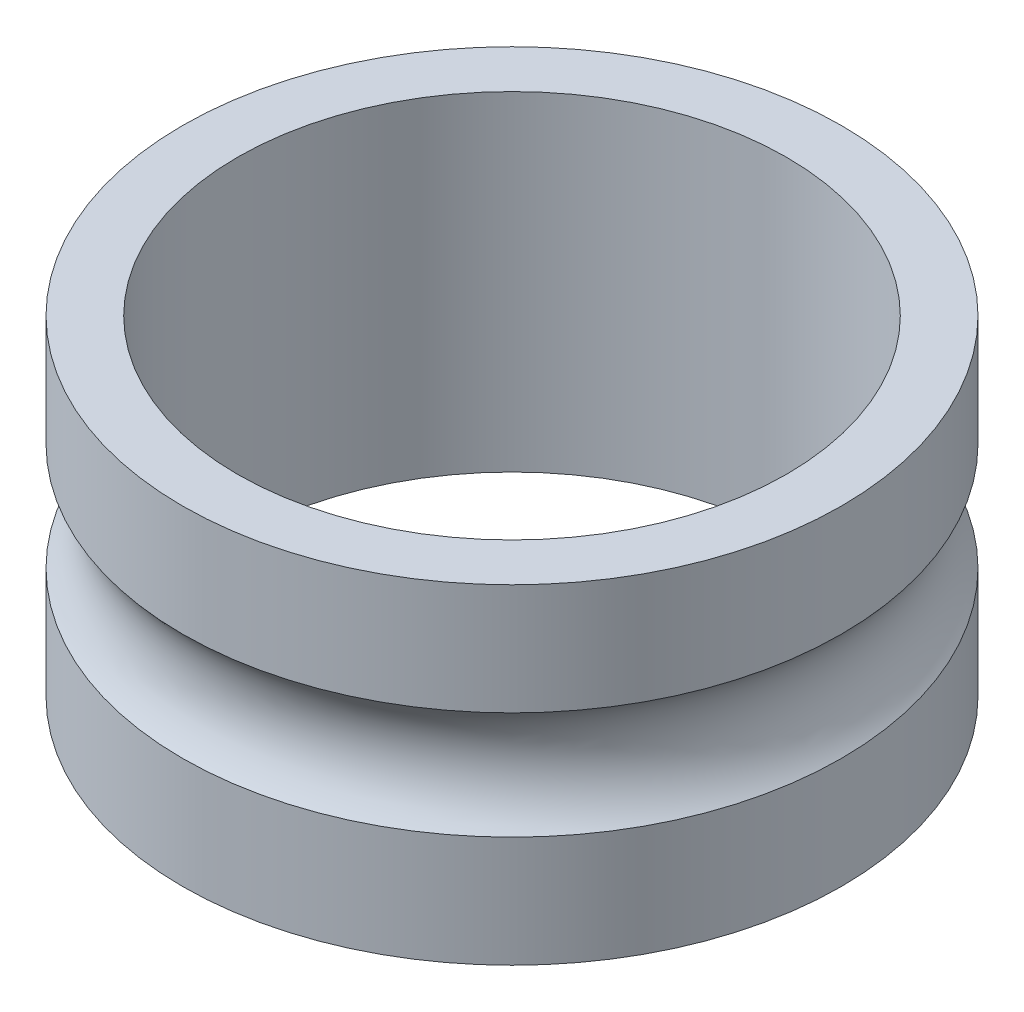
ISO-10303-21;
HEADER;
FILE_DESCRIPTION(('STEP AP214'),'2;1');
FILE_NAME('part.step','',(''),(''),'','','');
FILE_SCHEMA(('AUTOMOTIVE_DESIGN { 1 0 10303 214 1 1 1 1 }'));
ENDSEC;
DATA;
#1=APPLICATION_CONTEXT('core data for automotive mechanical design processes');
#2=APPLICATION_PROTOCOL_DEFINITION('international standard','automotive_design',2000,#1);
#3=PRODUCT_CONTEXT('',#1,'mechanical');
#4=PRODUCT('Part','Part','',(#3));
#5=PRODUCT_RELATED_PRODUCT_CATEGORY('part','',(#4));
#6=PRODUCT_DEFINITION_FORMATION('','',#4);
#7=PRODUCT_DEFINITION_CONTEXT('part definition',#1,'design');
#8=PRODUCT_DEFINITION('design','',#6,#7);
#9=PRODUCT_DEFINITION_SHAPE('','',#8);
#10=(LENGTH_UNIT() NAMED_UNIT(*) SI_UNIT(.MILLI.,.METRE.));
#11=(NAMED_UNIT(*) PLANE_ANGLE_UNIT() SI_UNIT($,.RADIAN.));
#12=(NAMED_UNIT(*) SI_UNIT($,.STERADIAN.) SOLID_ANGLE_UNIT());
#13=UNCERTAINTY_MEASURE_WITH_UNIT(LENGTH_MEASURE(1.E-05),#10,'distance_accuracy_value','');
#14=(GEOMETRIC_REPRESENTATION_CONTEXT(3) GLOBAL_UNCERTAINTY_ASSIGNED_CONTEXT((#13)) GLOBAL_UNIT_ASSIGNED_CONTEXT((#10,
#11,#12)) REPRESENTATION_CONTEXT('',''));
#15=CARTESIAN_POINT('',(0.,0.,0.));
#16=DIRECTION('',(0.,0.,1.));
#17=DIRECTION('',(1.,0.,0.));
#18=AXIS2_PLACEMENT_3D('',#15,#16,#17);
#19=CARTESIAN_POINT('',(0.,1.5,0.));
#20=DIRECTION('',(0.,-1.,0.));
#21=DIRECTION('',(0.,0.,-1.));
#22=AXIS2_PLACEMENT_3D('',#19,#20,#21);
#23=CYLINDRICAL_SURFACE('',#22,3.);
#24=CARTESIAN_POINT('',(0.,1.5,0.));
#25=DIRECTION('',(0.,1.,0.));
#26=DIRECTION('',(0.,0.,1.));
#27=AXIS2_PLACEMENT_3D('',#24,#25,#26);
#28=CIRCLE('',#27,3.);
#29=CARTESIAN_POINT('',(0.,1.5,3.));
#30=VERTEX_POINT('',#29);
#31=EDGE_CURVE('E10',#30,#30,#28,.T.);
#32=ORIENTED_EDGE('',*,*,#31,.F.);
#33=EDGE_LOOP('',(#32));
#34=FACE_BOUND('',#33,.T.);
#35=CARTESIAN_POINT('',(0.,0.489897948556636,0.));
#36=DIRECTION('',(0.,-1.,0.));
#37=DIRECTION('',(0.,0.,-1.));
#38=AXIS2_PLACEMENT_3D('',#35,#36,#37);
#39=CIRCLE('',#38,3.);
#40=CARTESIAN_POINT('',(0.,0.489897948556636,-3.));
#41=VERTEX_POINT('',#40);
#42=EDGE_CURVE('E35',#41,#41,#39,.T.);
#43=ORIENTED_EDGE('',*,*,#42,.F.);
#44=EDGE_LOOP('',(#43));
#45=FACE_BOUND('',#44,.T.);
#46=ADVANCED_FACE('F32',(#34,#45),#23,.T.);
#47=CARTESIAN_POINT('',(0.,-1.5,0.));
#48=DIRECTION('',(0.,1.,0.));
#49=DIRECTION('',(0.,0.,1.));
#50=AXIS2_PLACEMENT_3D('',#47,#48,#49);
#51=CIRCLE('',#50,3.);
#52=CARTESIAN_POINT('',(0.,-1.5,3.));
#53=VERTEX_POINT('',#52);
#54=EDGE_CURVE('E39',#53,#53,#51,.T.);
#55=ORIENTED_EDGE('',*,*,#54,.T.);
#56=EDGE_LOOP('',(#55));
#57=FACE_BOUND('',#56,.T.);
#58=CARTESIAN_POINT('',(0.,-0.489897948556636,0.));
#59=DIRECTION('',(0.,1.,0.));
#60=DIRECTION('',(0.,0.,1.));
#61=AXIS2_PLACEMENT_3D('',#58,#59,#60);
#62=CIRCLE('',#61,3.);
#63=CARTESIAN_POINT('',(0.,-0.489897948556636,3.));
#64=VERTEX_POINT('',#63);
#65=EDGE_CURVE('E49',#64,#64,#62,.T.);
#66=ORIENTED_EDGE('',*,*,#65,.F.);
#67=EDGE_LOOP('',(#66));
#68=FACE_BOUND('',#67,.T.);
#69=ADVANCED_FACE('F68',(#57,#68),#23,.T.);
#70=CARTESIAN_POINT('',(0.,1.5,0.));
#71=DIRECTION('',(0.,1.,0.));
#72=DIRECTION('',(0.,0.,1.));
#73=AXIS2_PLACEMENT_3D('',#70,#71,#72);
#74=PLANE('',#73);
#75=ORIENTED_EDGE('',*,*,#31,.T.);
#76=EDGE_LOOP('',(#75));
#77=FACE_BOUND('',#76,.T.);
#78=CARTESIAN_POINT('',(0.,1.5,0.));
#79=DIRECTION('',(0.,1.,0.));
#80=DIRECTION('',(0.,0.,1.));
#81=AXIS2_PLACEMENT_3D('',#78,#79,#80);
#82=CIRCLE('',#81,2.5);
#83=CARTESIAN_POINT('',(0.,1.5,2.5));
#84=VERTEX_POINT('',#83);
#85=EDGE_CURVE('E44',#84,#84,#82,.T.);
#86=ORIENTED_EDGE('',*,*,#85,.F.);
#87=EDGE_LOOP('',(#86));
#88=FACE_BOUND('',#87,.T.);
#89=ADVANCED_FACE('F65',(#77,#88),#74,.T.);
#90=CARTESIAN_POINT('',(0.,-1.5,0.));
#91=DIRECTION('',(0.,1.,0.));
#92=DIRECTION('',(0.,0.,1.));
#93=AXIS2_PLACEMENT_3D('',#90,#91,#92);
#94=PLANE('',#93);
#95=ORIENTED_EDGE('',*,*,#54,.F.);
#96=EDGE_LOOP('',(#95));
#97=FACE_BOUND('',#96,.T.);
#98=CARTESIAN_POINT('',(0.,-1.5,0.));
#99=DIRECTION('',(0.,1.,0.));
#100=DIRECTION('',(0.,0.,1.));
#101=AXIS2_PLACEMENT_3D('',#98,#99,#100);
#102=CIRCLE('',#101,2.5);
#103=CARTESIAN_POINT('',(0.,-1.5,2.5));
#104=VERTEX_POINT('',#103);
#105=EDGE_CURVE('E47',#104,#104,#102,.T.);
#106=ORIENTED_EDGE('',*,*,#105,.T.);
#107=EDGE_LOOP('',(#106));
#108=FACE_BOUND('',#107,.T.);
#109=ADVANCED_FACE('F67',(#97,#108),#94,.F.);
#110=CARTESIAN_POINT('',(0.,1.5,0.));
#111=DIRECTION('',(0.,-1.,0.));
#112=DIRECTION('',(0.,0.,-1.));
#113=AXIS2_PLACEMENT_3D('',#110,#111,#112);
#114=CYLINDRICAL_SURFACE('',#113,2.5);
#115=ORIENTED_EDGE('',*,*,#85,.T.);
#116=EDGE_LOOP('',(#115));
#117=FACE_BOUND('',#116,.T.);
#118=ORIENTED_EDGE('',*,*,#105,.F.);
#119=EDGE_LOOP('',(#118));
#120=FACE_BOUND('',#119,.T.);
#121=ADVANCED_FACE('F62',(#117,#120),#114,.F.);
#122=CARTESIAN_POINT('',(0.,0.,0.));
#123=DIRECTION('',(0.,1.,0.));
#124=DIRECTION('',(0.,0.,1.));
#125=AXIS2_PLACEMENT_3D('',#122,#123,#124);
#126=TOROIDAL_SURFACE('',#125,3.5,0.700000000000001);
#127=ORIENTED_EDGE('',*,*,#65,.T.);
#128=EDGE_LOOP('',(#127));
#129=FACE_BOUND('',#128,.T.);
#130=ORIENTED_EDGE('',*,*,#42,.T.);
#131=EDGE_LOOP('',(#130));
#132=FACE_BOUND('',#131,.T.);
#133=ADVANCED_FACE('F93',(#129,#132),#126,.F.);
#134=CLOSED_SHELL('',(#46,#69,#89,#109,#121,#133));
#135=MANIFOLD_SOLID_BREP('B2',#134);
#136=ADVANCED_BREP_SHAPE_REPRESENTATION('',(#18,#135),#14);
#137=SHAPE_DEFINITION_REPRESENTATION(#9,#136);
ENDSEC;
END-ISO-10303-21;
